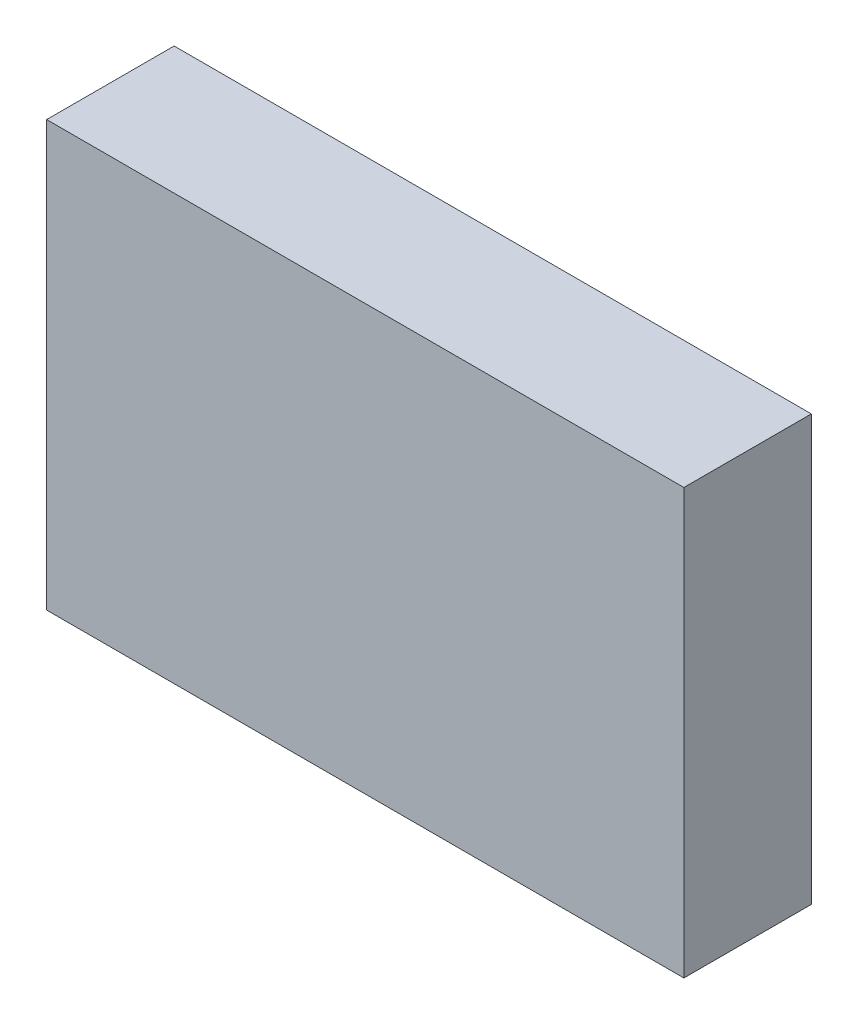
ISO-10303-21;
HEADER;
FILE_DESCRIPTION(('STEP AP214'),'2;1');
FILE_NAME('part.step','',(''),(''),'','','');
FILE_SCHEMA(('AUTOMOTIVE_DESIGN { 1 0 10303 214 1 1 1 1 }'));
ENDSEC;
DATA;
#1=APPLICATION_CONTEXT('core data for automotive mechanical design processes');
#2=APPLICATION_PROTOCOL_DEFINITION('international standard','automotive_design',2000,#1);
#3=PRODUCT_CONTEXT('',#1,'mechanical');
#4=PRODUCT('Part','Part','',(#3));
#5=PRODUCT_RELATED_PRODUCT_CATEGORY('part','',(#4));
#6=PRODUCT_DEFINITION_FORMATION('','',#4);
#7=PRODUCT_DEFINITION_CONTEXT('part definition',#1,'design');
#8=PRODUCT_DEFINITION('design','',#6,#7);
#9=PRODUCT_DEFINITION_SHAPE('','',#8);
#10=(LENGTH_UNIT() NAMED_UNIT(*) SI_UNIT(.MILLI.,.METRE.));
#11=(NAMED_UNIT(*) PLANE_ANGLE_UNIT() SI_UNIT($,.RADIAN.));
#12=(NAMED_UNIT(*) SI_UNIT($,.STERADIAN.) SOLID_ANGLE_UNIT());
#13=UNCERTAINTY_MEASURE_WITH_UNIT(LENGTH_MEASURE(1.E-05),#10,'distance_accuracy_value','');
#14=(GEOMETRIC_REPRESENTATION_CONTEXT(3) GLOBAL_UNCERTAINTY_ASSIGNED_CONTEXT((#13)) GLOBAL_UNIT_ASSIGNED_CONTEXT((#10,
#11,#12)) REPRESENTATION_CONTEXT('',''));
#15=CARTESIAN_POINT('',(0.,0.,0.));
#16=DIRECTION('',(0.,0.,1.));
#17=DIRECTION('',(1.,0.,0.));
#18=AXIS2_PLACEMENT_3D('',#15,#16,#17);
#19=CARTESIAN_POINT('',(-21.2547459747058,5.06192551978508,6.));
#20=DIRECTION('',(1.,0.,0.));
#21=DIRECTION('',(0.,1.,0.));
#22=AXIS2_PLACEMENT_3D('',#19,#20,#21);
#23=PLANE('',#22);
#24=DIRECTION('',(0.,-1.,0.));
#25=VECTOR('',#24,1.);
#26=CARTESIAN_POINT('',(-21.2547459747058,5.06192551978508,0.));
#27=LINE('',#26,#25);
#28=CARTESIAN_POINT('',(-21.2547459747058,5.06192551978508,0.));
#29=VERTEX_POINT('',#28);
#30=CARTESIAN_POINT('',(-21.2547459747058,-14.9380744802149,0.));
#31=VERTEX_POINT('',#30);
#32=EDGE_CURVE('E98',#29,#31,#27,.T.);
#33=ORIENTED_EDGE('',*,*,#32,.T.);
#34=DIRECTION('',(0.,0.,-1.));
#35=VECTOR('',#34,1.);
#36=CARTESIAN_POINT('',(-21.2547459747058,-14.9380744802149,6.));
#37=LINE('',#36,#35);
#38=CARTESIAN_POINT('',(-21.2547459747058,-14.9380744802149,6.));
#39=VERTEX_POINT('',#38);
#40=EDGE_CURVE('E11',#39,#31,#37,.T.);
#41=ORIENTED_EDGE('',*,*,#40,.F.);
#42=DIRECTION('',(0.,-1.,0.));
#43=VECTOR('',#42,1.);
#44=CARTESIAN_POINT('',(-21.2547459747058,5.06192551978508,6.));
#45=LINE('',#44,#43);
#46=CARTESIAN_POINT('',(-21.2547459747058,5.06192551978508,6.));
#47=VERTEX_POINT('',#46);
#48=EDGE_CURVE('E86',#47,#39,#45,.T.);
#49=ORIENTED_EDGE('',*,*,#48,.F.);
#50=DIRECTION('',(0.,0.,-1.));
#51=VECTOR('',#50,1.);
#52=CARTESIAN_POINT('',(-21.2547459747058,5.06192551978508,6.));
#53=LINE('',#52,#51);
#54=EDGE_CURVE('E94',#47,#29,#53,.T.);
#55=ORIENTED_EDGE('',*,*,#54,.T.);
#56=EDGE_LOOP('',(#33,#41,#49,#55));
#57=FACE_BOUND('',#56,.T.);
#58=ADVANCED_FACE('F35',(#57),#23,.F.);
#59=CARTESIAN_POINT('',(-21.2547459747058,-14.9380744802149,6.));
#60=DIRECTION('',(0.,1.,0.));
#61=DIRECTION('',(0.,0.,1.));
#62=AXIS2_PLACEMENT_3D('',#59,#60,#61);
#63=PLANE('',#62);
#64=DIRECTION('',(1.,0.,0.));
#65=VECTOR('',#64,1.);
#66=CARTESIAN_POINT('',(-21.2547459747058,-14.9380744802149,0.));
#67=LINE('',#66,#65);
#68=CARTESIAN_POINT('',(8.74525402529422,-14.9380744802149,0.));
#69=VERTEX_POINT('',#68);
#70=EDGE_CURVE('E90',#31,#69,#67,.T.);
#71=ORIENTED_EDGE('',*,*,#70,.T.);
#72=DIRECTION('',(0.,0.,-1.));
#73=VECTOR('',#72,1.);
#74=CARTESIAN_POINT('',(8.74525402529422,-14.9380744802149,6.));
#75=LINE('',#74,#73);
#76=CARTESIAN_POINT('',(8.74525402529422,-14.9380744802149,6.));
#77=VERTEX_POINT('',#76);
#78=EDGE_CURVE('E43',#77,#69,#75,.T.);
#79=ORIENTED_EDGE('',*,*,#78,.F.);
#80=DIRECTION('',(1.,0.,0.));
#81=VECTOR('',#80,1.);
#82=CARTESIAN_POINT('',(-21.2547459747058,-14.9380744802149,6.));
#83=LINE('',#82,#81);
#84=EDGE_CURVE('E81',#39,#77,#83,.T.);
#85=ORIENTED_EDGE('',*,*,#84,.F.);
#86=ORIENTED_EDGE('',*,*,#40,.T.);
#87=EDGE_LOOP('',(#71,#79,#85,#86));
#88=FACE_BOUND('',#87,.T.);
#89=ADVANCED_FACE('F89',(#88),#63,.F.);
#90=CARTESIAN_POINT('',(8.74525402529421,5.06192551978508,6.));
#91=DIRECTION('',(-1.,0.,0.));
#92=DIRECTION('',(0.,-1.,0.));
#93=AXIS2_PLACEMENT_3D('',#90,#91,#92);
#94=PLANE('',#93);
#95=DIRECTION('',(0.,1.,0.));
#96=VECTOR('',#95,1.);
#97=CARTESIAN_POINT('',(8.74525402529421,5.06192551978508,0.));
#98=LINE('',#97,#96);
#99=CARTESIAN_POINT('',(8.74525402529421,5.06192551978508,0.));
#100=VERTEX_POINT('',#99);
#101=EDGE_CURVE('E68',#69,#100,#98,.T.);
#102=ORIENTED_EDGE('',*,*,#101,.T.);
#103=DIRECTION('',(0.,0.,-1.));
#104=VECTOR('',#103,1.);
#105=CARTESIAN_POINT('',(8.74525402529421,5.06192551978508,6.));
#106=LINE('',#105,#104);
#107=CARTESIAN_POINT('',(8.74525402529421,5.06192551978508,6.));
#108=VERTEX_POINT('',#107);
#109=EDGE_CURVE('E91',#108,#100,#106,.T.);
#110=ORIENTED_EDGE('',*,*,#109,.F.);
#111=DIRECTION('',(0.,1.,0.));
#112=VECTOR('',#111,1.);
#113=CARTESIAN_POINT('',(8.74525402529421,5.06192551978508,6.));
#114=LINE('',#113,#112);
#115=EDGE_CURVE('E84',#77,#108,#114,.T.);
#116=ORIENTED_EDGE('',*,*,#115,.F.);
#117=ORIENTED_EDGE('',*,*,#78,.T.);
#118=EDGE_LOOP('',(#102,#110,#116,#117));
#119=FACE_BOUND('',#118,.T.);
#120=ADVANCED_FACE('F92',(#119),#94,.F.);
#121=CARTESIAN_POINT('',(-21.2547459747058,5.06192551978508,6.));
#122=DIRECTION('',(0.,-1.,0.));
#123=DIRECTION('',(0.,0.,-1.));
#124=AXIS2_PLACEMENT_3D('',#121,#122,#123);
#125=PLANE('',#124);
#126=DIRECTION('',(-1.,0.,0.));
#127=VECTOR('',#126,1.);
#128=CARTESIAN_POINT('',(-21.2547459747058,5.06192551978508,0.));
#129=LINE('',#128,#127);
#130=EDGE_CURVE('E74',#100,#29,#129,.T.);
#131=ORIENTED_EDGE('',*,*,#130,.T.);
#132=ORIENTED_EDGE('',*,*,#54,.F.);
#133=DIRECTION('',(-1.,0.,0.));
#134=VECTOR('',#133,1.);
#135=CARTESIAN_POINT('',(-21.2547459747058,5.06192551978508,6.));
#136=LINE('',#135,#134);
#137=EDGE_CURVE('E51',#108,#47,#136,.T.);
#138=ORIENTED_EDGE('',*,*,#137,.F.);
#139=ORIENTED_EDGE('',*,*,#109,.T.);
#140=EDGE_LOOP('',(#131,#132,#138,#139));
#141=FACE_BOUND('',#140,.T.);
#142=ADVANCED_FACE('F105',(#141),#125,.F.);
#143=CARTESIAN_POINT('',(0.,0.,6.));
#144=DIRECTION('',(0.,0.,1.));
#145=DIRECTION('',(1.,0.,0.));
#146=AXIS2_PLACEMENT_3D('',#143,#144,#145);
#147=PLANE('',#146);
#148=ORIENTED_EDGE('',*,*,#48,.T.);
#149=ORIENTED_EDGE('',*,*,#84,.T.);
#150=ORIENTED_EDGE('',*,*,#115,.T.);
#151=ORIENTED_EDGE('',*,*,#137,.T.);
#152=EDGE_LOOP('',(#148,#149,#150,#151));
#153=FACE_BOUND('',#152,.T.);
#154=ADVANCED_FACE('F82',(#153),#147,.T.);
#155=CARTESIAN_POINT('',(0.,0.,0.));
#156=DIRECTION('',(0.,0.,1.));
#157=DIRECTION('',(1.,0.,0.));
#158=AXIS2_PLACEMENT_3D('',#155,#156,#157);
#159=PLANE('',#158);
#160=ORIENTED_EDGE('',*,*,#32,.F.);
#161=ORIENTED_EDGE('',*,*,#130,.F.);
#162=ORIENTED_EDGE('',*,*,#101,.F.);
#163=ORIENTED_EDGE('',*,*,#70,.F.);
#164=EDGE_LOOP('',(#160,#161,#162,#163));
#165=FACE_BOUND('',#164,.T.);
#166=ADVANCED_FACE('F108',(#165),#159,.F.);
#167=CLOSED_SHELL('',(#58,#89,#120,#142,#154,#166));
#168=MANIFOLD_SOLID_BREP('B2',#167);
#169=ADVANCED_BREP_SHAPE_REPRESENTATION('',(#18,#168),#14);
#170=SHAPE_DEFINITION_REPRESENTATION(#9,#169);
ENDSEC;
END-ISO-10303-21;
